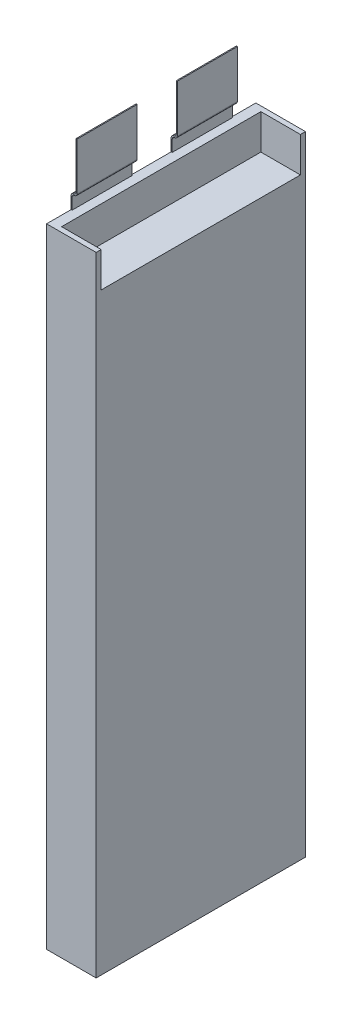
ISO-10303-21;
HEADER;
FILE_DESCRIPTION(('STEP AP214'),'2;1');
FILE_NAME('part.step','',(''),(''),'','','');
FILE_SCHEMA(('AUTOMOTIVE_DESIGN { 1 0 10303 214 1 1 1 1 }'));
ENDSEC;
DATA;
#1=APPLICATION_CONTEXT('core data for automotive mechanical design processes');
#2=APPLICATION_PROTOCOL_DEFINITION('international standard','automotive_design',2000,#1);
#3=PRODUCT_CONTEXT('',#1,'mechanical');
#4=PRODUCT('Part','Part','',(#3));
#5=PRODUCT_RELATED_PRODUCT_CATEGORY('part','',(#4));
#6=PRODUCT_DEFINITION_FORMATION('','',#4);
#7=PRODUCT_DEFINITION_CONTEXT('part definition',#1,'design');
#8=PRODUCT_DEFINITION('design','',#6,#7);
#9=PRODUCT_DEFINITION_SHAPE('','',#8);
#10=(LENGTH_UNIT() NAMED_UNIT(*) SI_UNIT(.MILLI.,.METRE.));
#11=(NAMED_UNIT(*) PLANE_ANGLE_UNIT() SI_UNIT($,.RADIAN.));
#12=(NAMED_UNIT(*) SI_UNIT($,.STERADIAN.) SOLID_ANGLE_UNIT());
#13=UNCERTAINTY_MEASURE_WITH_UNIT(LENGTH_MEASURE(1.E-05),#10,'distance_accuracy_value','');
#14=(GEOMETRIC_REPRESENTATION_CONTEXT(3) GLOBAL_UNCERTAINTY_ASSIGNED_CONTEXT((#13)) GLOBAL_UNIT_ASSIGNED_CONTEXT((#10,
#11,#12)) REPRESENTATION_CONTEXT('',''));
#15=CARTESIAN_POINT('',(0.,0.,0.));
#16=DIRECTION('',(0.,0.,1.));
#17=DIRECTION('',(1.,0.,0.));
#18=AXIS2_PLACEMENT_3D('',#15,#16,#17);
#19=CARTESIAN_POINT('',(0.,150.5,-16.9));
#20=DIRECTION('',(0.,0.,-1.));
#21=DIRECTION('',(0.,-1.,0.));
#22=AXIS2_PLACEMENT_3D('',#19,#20,#21);
#23=PLANE('',#22);
#24=DIRECTION('',(0.,-1.,0.));
#25=VECTOR('',#24,1.);
#26=CARTESIAN_POINT('',(1.,150.5,-16.9));
#27=LINE('',#26,#25);
#28=CARTESIAN_POINT('',(1.,128.,-16.9));
#29=VERTEX_POINT('',#28);
#30=CARTESIAN_POINT('',(1.,125.5,-16.9));
#31=VERTEX_POINT('',#30);
#32=EDGE_CURVE('P0_E170',#29,#31,#27,.T.);
#33=ORIENTED_EDGE('',*,*,#32,.F.);
#34=CARTESIAN_POINT('',(1.5,128.,-16.9));
#35=DIRECTION('',(0.,0.,-1.));
#36=DIRECTION('',(-1.,0.,0.));
#37=AXIS2_PLACEMENT_3D('',#34,#35,#36);
#38=CIRCLE('',#37,0.5);
#39=CARTESIAN_POINT('',(1.5,128.5,-16.9));
#40=VERTEX_POINT('',#39);
#41=EDGE_CURVE('P0_E194',#29,#40,#38,.T.);
#42=ORIENTED_EDGE('',*,*,#41,.T.);
#43=CARTESIAN_POINT('',(1.5,129.,-16.9));
#44=DIRECTION('',(0.,0.,-1.));
#45=DIRECTION('',(-1.,0.,0.));
#46=AXIS2_PLACEMENT_3D('',#43,#44,#45);
#47=CIRCLE('',#46,0.5);
#48=CARTESIAN_POINT('',(2.,129.,-16.9));
#49=VERTEX_POINT('',#48);
#50=EDGE_CURVE('P0_E204',#40,#49,#47,.F.);
#51=ORIENTED_EDGE('',*,*,#50,.T.);
#52=DIRECTION('',(0.,-1.,0.));
#53=VECTOR('',#52,1.);
#54=CARTESIAN_POINT('',(2.,128.5,-16.9));
#55=LINE('',#54,#53);
#56=CARTESIAN_POINT('',(2.,138.3,-16.9));
#57=VERTEX_POINT('',#56);
#58=EDGE_CURVE('P0_E138',#57,#49,#55,.T.);
#59=ORIENTED_EDGE('',*,*,#58,.F.);
#60=DIRECTION('',(-1.,0.,0.));
#61=VECTOR('',#60,1.);
#62=CARTESIAN_POINT('',(2.,138.3,-16.9));
#63=LINE('',#62,#61);
#64=CARTESIAN_POINT('',(2.2,138.3,-16.9));
#65=VERTEX_POINT('',#64);
#66=EDGE_CURVE('P0_E135',#65,#57,#63,.T.);
#67=ORIENTED_EDGE('',*,*,#66,.F.);
#68=DIRECTION('',(0.,1.,0.));
#69=VECTOR('',#68,1.);
#70=CARTESIAN_POINT('',(2.2,138.3,-16.9));
#71=LINE('',#70,#69);
#72=CARTESIAN_POINT('',(2.2,128.8,-16.9));
#73=VERTEX_POINT('',#72);
#74=EDGE_CURVE('P0_E147',#73,#65,#71,.T.);
#75=ORIENTED_EDGE('',*,*,#74,.F.);
#76=CARTESIAN_POINT('',(1.7,128.8,-16.9));
#77=DIRECTION('',(0.,0.,-1.));
#78=DIRECTION('',(-1.,0.,0.));
#79=AXIS2_PLACEMENT_3D('',#76,#77,#78);
#80=CIRCLE('',#79,0.5);
#81=CARTESIAN_POINT('',(1.7,128.3,-16.9));
#82=VERTEX_POINT('',#81);
#83=EDGE_CURVE('P0_E69',#73,#82,#80,.T.);
#84=ORIENTED_EDGE('',*,*,#83,.T.);
#85=CARTESIAN_POINT('',(1.7,127.8,-16.9));
#86=DIRECTION('',(0.,0.,-1.));
#87=DIRECTION('',(-1.,0.,0.));
#88=AXIS2_PLACEMENT_3D('',#85,#86,#87);
#89=CIRCLE('',#88,0.5);
#90=CARTESIAN_POINT('',(1.2,127.8,-16.9));
#91=VERTEX_POINT('',#90);
#92=EDGE_CURVE('P0_E57',#82,#91,#89,.F.);
#93=ORIENTED_EDGE('',*,*,#92,.T.);
#94=DIRECTION('',(0.,-1.,0.));
#95=VECTOR('',#94,1.);
#96=CARTESIAN_POINT('',(1.2,150.5,-16.9));
#97=LINE('',#96,#95);
#98=CARTESIAN_POINT('',(1.2,125.5,-16.9));
#99=VERTEX_POINT('',#98);
#100=EDGE_CURVE('P0_E178',#91,#99,#97,.T.);
#101=ORIENTED_EDGE('',*,*,#100,.T.);
#102=DIRECTION('',(1.,0.,0.));
#103=VECTOR('',#102,1.);
#104=CARTESIAN_POINT('',(0.,125.5,-16.9));
#105=LINE('',#104,#103);
#106=EDGE_CURVE('P0_E174',#31,#99,#105,.T.);
#107=ORIENTED_EDGE('',*,*,#106,.F.);
#108=EDGE_LOOP('',(#33,#42,#51,#59,#67,#75,#84,#93,#101,#107));
#109=FACE_BOUND('',#108,.T.);
#110=ADVANCED_FACE('P0_F48',(#109),#23,.T.);
#111=CARTESIAN_POINT('',(1.,150.5,0.));
#112=DIRECTION('',(1.,0.,0.));
#113=DIRECTION('',(0.,1.,0.));
#114=AXIS2_PLACEMENT_3D('',#111,#112,#113);
#115=PLANE('',#114);
#116=DIRECTION('',(0.,-1.,0.));
#117=VECTOR('',#116,1.);
#118=CARTESIAN_POINT('',(1.,150.5,-4.9));
#119=LINE('',#118,#117);
#120=CARTESIAN_POINT('',(1.,128.,-4.9));
#121=VERTEX_POINT('',#120);
#122=CARTESIAN_POINT('',(1.,125.5,-4.9));
#123=VERTEX_POINT('',#122);
#124=EDGE_CURVE('P0_E163',#121,#123,#119,.T.);
#125=ORIENTED_EDGE('',*,*,#124,.F.);
#126=DIRECTION('',(0.,0.,1.));
#127=VECTOR('',#126,1.);
#128=CARTESIAN_POINT('',(1.,128.,-16.9));
#129=LINE('',#128,#127);
#130=EDGE_CURVE('P0_E190',#121,#29,#129,.F.);
#131=ORIENTED_EDGE('',*,*,#130,.T.);
#132=ORIENTED_EDGE('',*,*,#32,.T.);
#133=DIRECTION('',(0.,0.,1.));
#134=VECTOR('',#133,1.);
#135=CARTESIAN_POINT('',(1.,125.5,0.));
#136=LINE('',#135,#134);
#137=EDGE_CURVE('P0_E172',#31,#123,#136,.T.);
#138=ORIENTED_EDGE('',*,*,#137,.T.);
#139=EDGE_LOOP('',(#125,#131,#132,#138));
#140=FACE_BOUND('',#139,.T.);
#141=ADVANCED_FACE('P0_F232',(#140),#115,.F.);
#142=CARTESIAN_POINT('',(0.,150.5,-4.9));
#143=DIRECTION('',(0.,0.,-1.));
#144=DIRECTION('',(0.,-1.,0.));
#145=AXIS2_PLACEMENT_3D('',#142,#143,#144);
#146=PLANE('',#145);
#147=DIRECTION('',(0.,-1.,0.));
#148=VECTOR('',#147,1.);
#149=CARTESIAN_POINT('',(2.,128.5,-4.9));
#150=LINE('',#149,#148);
#151=CARTESIAN_POINT('',(2.,138.3,-4.9));
#152=VERTEX_POINT('',#151);
#153=CARTESIAN_POINT('',(2.,129.,-4.9));
#154=VERTEX_POINT('',#153);
#155=EDGE_CURVE('P0_E141',#152,#154,#150,.T.);
#156=ORIENTED_EDGE('',*,*,#155,.T.);
#157=CARTESIAN_POINT('',(1.5,129.,-4.9));
#158=DIRECTION('',(0.,0.,-1.));
#159=DIRECTION('',(-1.,0.,0.));
#160=AXIS2_PLACEMENT_3D('',#157,#158,#159);
#161=CIRCLE('',#160,0.5);
#162=CARTESIAN_POINT('',(1.5,128.5,-4.9));
#163=VERTEX_POINT('',#162);
#164=EDGE_CURVE('P0_E202',#154,#163,#161,.T.);
#165=ORIENTED_EDGE('',*,*,#164,.T.);
#166=CARTESIAN_POINT('',(1.5,128.,-4.9));
#167=DIRECTION('',(0.,0.,-1.));
#168=DIRECTION('',(-1.,0.,0.));
#169=AXIS2_PLACEMENT_3D('',#166,#167,#168);
#170=CIRCLE('',#169,0.5);
#171=EDGE_CURVE('P0_E188',#163,#121,#170,.F.);
#172=ORIENTED_EDGE('',*,*,#171,.T.);
#173=ORIENTED_EDGE('',*,*,#124,.T.);
#174=DIRECTION('',(1.,0.,0.));
#175=VECTOR('',#174,1.);
#176=CARTESIAN_POINT('',(0.,125.5,-4.9));
#177=LINE('',#176,#175);
#178=CARTESIAN_POINT('',(1.2,125.5,-4.9));
#179=VERTEX_POINT('',#178);
#180=EDGE_CURVE('P0_E165',#123,#179,#177,.T.);
#181=ORIENTED_EDGE('',*,*,#180,.T.);
#182=DIRECTION('',(0.,-1.,0.));
#183=VECTOR('',#182,1.);
#184=CARTESIAN_POINT('',(1.2,150.5,-4.9));
#185=LINE('',#184,#183);
#186=CARTESIAN_POINT('',(1.2,127.8,-4.9));
#187=VERTEX_POINT('',#186);
#188=EDGE_CURVE('P0_E166',#187,#179,#185,.T.);
#189=ORIENTED_EDGE('',*,*,#188,.F.);
#190=CARTESIAN_POINT('',(1.7,127.8,-4.9));
#191=DIRECTION('',(0.,0.,-1.));
#192=DIRECTION('',(-1.,0.,0.));
#193=AXIS2_PLACEMENT_3D('',#190,#191,#192);
#194=CIRCLE('',#193,0.5);
#195=CARTESIAN_POINT('',(1.7,128.3,-4.9));
#196=VERTEX_POINT('',#195);
#197=EDGE_CURVE('P0_E12',#187,#196,#194,.T.);
#198=ORIENTED_EDGE('',*,*,#197,.T.);
#199=CARTESIAN_POINT('',(1.7,128.8,-4.9));
#200=DIRECTION('',(0.,0.,-1.));
#201=DIRECTION('',(-1.,0.,0.));
#202=AXIS2_PLACEMENT_3D('',#199,#200,#201);
#203=CIRCLE('',#202,0.5);
#204=CARTESIAN_POINT('',(2.2,128.8,-4.9));
#205=VERTEX_POINT('',#204);
#206=EDGE_CURVE('P0_E180',#196,#205,#203,.F.);
#207=ORIENTED_EDGE('',*,*,#206,.T.);
#208=DIRECTION('',(0.,1.,0.));
#209=VECTOR('',#208,1.);
#210=CARTESIAN_POINT('',(2.2,138.3,-4.9));
#211=LINE('',#210,#209);
#212=CARTESIAN_POINT('',(2.2,138.3,-4.9));
#213=VERTEX_POINT('',#212);
#214=EDGE_CURVE('P0_E151',#205,#213,#211,.T.);
#215=ORIENTED_EDGE('',*,*,#214,.T.);
#216=DIRECTION('',(-1.,0.,0.));
#217=VECTOR('',#216,1.);
#218=CARTESIAN_POINT('',(2.,138.3,-4.9));
#219=LINE('',#218,#217);
#220=EDGE_CURVE('P0_E133',#213,#152,#219,.T.);
#221=ORIENTED_EDGE('',*,*,#220,.T.);
#222=EDGE_LOOP('',(#156,#165,#172,#173,#181,#189,#198,#207,#215,#221));
#223=FACE_BOUND('',#222,.T.);
#224=ADVANCED_FACE('P0_F149',(#223),#146,.F.);
#225=CARTESIAN_POINT('',(1.2,150.5,0.));
#226=DIRECTION('',(1.,0.,0.));
#227=DIRECTION('',(0.,1.,0.));
#228=AXIS2_PLACEMENT_3D('',#225,#226,#227);
#229=PLANE('',#228);
#230=ORIENTED_EDGE('',*,*,#100,.F.);
#231=DIRECTION('',(0.,0.,-1.));
#232=VECTOR('',#231,1.);
#233=CARTESIAN_POINT('',(1.2,127.8,-4.9));
#234=LINE('',#233,#232);
#235=EDGE_CURVE('P0_E200',#91,#187,#234,.F.);
#236=ORIENTED_EDGE('',*,*,#235,.T.);
#237=ORIENTED_EDGE('',*,*,#188,.T.);
#238=DIRECTION('',(0.,0.,1.));
#239=VECTOR('',#238,1.);
#240=CARTESIAN_POINT('',(1.2,125.5,0.));
#241=LINE('',#240,#239);
#242=EDGE_CURVE('P0_E158',#99,#179,#241,.T.);
#243=ORIENTED_EDGE('',*,*,#242,.F.);
#244=EDGE_LOOP('',(#230,#236,#237,#243));
#245=FACE_BOUND('',#244,.T.);
#246=ADVANCED_FACE('P0_F221',(#245),#229,.T.);
#247=CARTESIAN_POINT('',(0.,125.5,0.));
#248=DIRECTION('',(0.,1.,0.));
#249=DIRECTION('',(1.,0.,0.));
#250=AXIS2_PLACEMENT_3D('',#247,#248,#249);
#251=PLANE('',#250);
#252=ORIENTED_EDGE('',*,*,#106,.T.);
#253=ORIENTED_EDGE('',*,*,#242,.T.);
#254=ORIENTED_EDGE('',*,*,#180,.F.);
#255=ORIENTED_EDGE('',*,*,#137,.F.);
#256=EDGE_LOOP('',(#252,#253,#254,#255));
#257=FACE_BOUND('',#256,.T.);
#258=ADVANCED_FACE('P0_F227',(#257),#251,.F.);
#259=CARTESIAN_POINT('',(2.2,138.3,-26.9717426496113));
#260=DIRECTION('',(1.,0.,0.));
#261=DIRECTION('',(0.,1.,0.));
#262=AXIS2_PLACEMENT_3D('',#259,#260,#261);
#263=PLANE('',#262);
#264=ORIENTED_EDGE('',*,*,#214,.F.);
#265=DIRECTION('',(0.,0.,1.));
#266=VECTOR('',#265,1.);
#267=CARTESIAN_POINT('',(2.2,128.8,-26.9717426496113));
#268=LINE('',#267,#266);
#269=EDGE_CURVE('P0_E197',#205,#73,#268,.F.);
#270=ORIENTED_EDGE('',*,*,#269,.T.);
#271=ORIENTED_EDGE('',*,*,#74,.T.);
#272=DIRECTION('',(0.,0.,1.));
#273=VECTOR('',#272,1.);
#274=CARTESIAN_POINT('',(2.2,138.3,-26.9717426496113));
#275=LINE('',#274,#273);
#276=EDGE_CURVE('P0_E160',#65,#213,#275,.T.);
#277=ORIENTED_EDGE('',*,*,#276,.T.);
#278=EDGE_LOOP('',(#264,#270,#271,#277));
#279=FACE_BOUND('',#278,.T.);
#280=ADVANCED_FACE('P0_F238',(#279),#263,.T.);
#281=CARTESIAN_POINT('',(2.,138.3,-26.9717426496113));
#282=DIRECTION('',(0.,1.,0.));
#283=DIRECTION('',(0.,0.,1.));
#284=AXIS2_PLACEMENT_3D('',#281,#282,#283);
#285=PLANE('',#284);
#286=ORIENTED_EDGE('',*,*,#276,.F.);
#287=ORIENTED_EDGE('',*,*,#66,.T.);
#288=DIRECTION('',(0.,0.,1.));
#289=VECTOR('',#288,1.);
#290=CARTESIAN_POINT('',(2.,138.3,-26.9717426496113));
#291=LINE('',#290,#289);
#292=EDGE_CURVE('P0_E128',#57,#152,#291,.T.);
#293=ORIENTED_EDGE('',*,*,#292,.T.);
#294=ORIENTED_EDGE('',*,*,#220,.F.);
#295=EDGE_LOOP('',(#286,#287,#293,#294));
#296=FACE_BOUND('',#295,.T.);
#297=ADVANCED_FACE('P0_F131',(#296),#285,.T.);
#298=CARTESIAN_POINT('',(2.,128.5,-26.9717426496113));
#299=DIRECTION('',(-1.,0.,0.));
#300=DIRECTION('',(0.,0.,1.));
#301=AXIS2_PLACEMENT_3D('',#298,#299,#300);
#302=PLANE('',#301);
#303=ORIENTED_EDGE('',*,*,#58,.T.);
#304=DIRECTION('',(0.,0.,1.));
#305=VECTOR('',#304,1.);
#306=CARTESIAN_POINT('',(2.,129.,-4.9));
#307=LINE('',#306,#305);
#308=EDGE_CURVE('P0_E144',#49,#154,#307,.T.);
#309=ORIENTED_EDGE('',*,*,#308,.T.);
#310=ORIENTED_EDGE('',*,*,#155,.F.);
#311=ORIENTED_EDGE('',*,*,#292,.F.);
#312=EDGE_LOOP('',(#303,#309,#310,#311));
#313=FACE_BOUND('',#312,.T.);
#314=ADVANCED_FACE('P0_F142',(#313),#302,.T.);
#315=CARTESIAN_POINT('',(1.5,129.,-26.9717426496113));
#316=DIRECTION('',(0.,0.,-1.));
#317=DIRECTION('',(-1.,0.,0.));
#318=AXIS2_PLACEMENT_3D('',#315,#316,#317);
#319=CYLINDRICAL_SURFACE('',#318,0.5);
#320=ORIENTED_EDGE('',*,*,#308,.F.);
#321=ORIENTED_EDGE('',*,*,#50,.F.);
#322=DIRECTION('',(0.,0.,1.));
#323=VECTOR('',#322,1.);
#324=CARTESIAN_POINT('',(1.5,128.5,-16.9));
#325=LINE('',#324,#323);
#326=EDGE_CURVE('P0_E154',#163,#40,#325,.F.);
#327=ORIENTED_EDGE('',*,*,#326,.F.);
#328=ORIENTED_EDGE('',*,*,#164,.F.);
#329=EDGE_LOOP('',(#320,#321,#327,#328));
#330=FACE_BOUND('',#329,.T.);
#331=ADVANCED_FACE('P0_F236',(#330),#319,.F.);
#332=CARTESIAN_POINT('',(1.5,128.,-49.1969532372423));
#333=DIRECTION('',(0.,0.,-1.));
#334=DIRECTION('',(-1.,0.,0.));
#335=AXIS2_PLACEMENT_3D('',#332,#333,#334);
#336=CYLINDRICAL_SURFACE('',#335,0.5);
#337=ORIENTED_EDGE('',*,*,#41,.F.);
#338=ORIENTED_EDGE('',*,*,#130,.F.);
#339=ORIENTED_EDGE('',*,*,#171,.F.);
#340=ORIENTED_EDGE('',*,*,#326,.T.);
#341=EDGE_LOOP('',(#337,#338,#339,#340));
#342=FACE_BOUND('',#341,.T.);
#343=ADVANCED_FACE('P0_F234',(#342),#336,.T.);
#344=CARTESIAN_POINT('',(1.69999999999999,127.8,-26.9717426496113));
#345=DIRECTION('',(0.,0.,1.));
#346=DIRECTION('',(1.,0.,0.));
#347=AXIS2_PLACEMENT_3D('',#344,#345,#346);
#348=CYLINDRICAL_SURFACE('',#347,0.5);
#349=ORIENTED_EDGE('',*,*,#235,.F.);
#350=ORIENTED_EDGE('',*,*,#92,.F.);
#351=DIRECTION('',(0.,0.,-1.));
#352=VECTOR('',#351,1.);
#353=CARTESIAN_POINT('',(1.7,128.3,-16.9));
#354=LINE('',#353,#352);
#355=EDGE_CURVE('P0_E52',#196,#82,#354,.T.);
#356=ORIENTED_EDGE('',*,*,#355,.F.);
#357=ORIENTED_EDGE('',*,*,#197,.F.);
#358=EDGE_LOOP('',(#349,#350,#356,#357));
#359=FACE_BOUND('',#358,.T.);
#360=ADVANCED_FACE('P0_F50',(#359),#348,.F.);
#361=CARTESIAN_POINT('',(1.7,128.8,-26.9717426496113));
#362=DIRECTION('',(0.,0.,1.));
#363=DIRECTION('',(1.,0.,0.));
#364=AXIS2_PLACEMENT_3D('',#361,#362,#363);
#365=CYLINDRICAL_SURFACE('',#364,0.5);
#366=ORIENTED_EDGE('',*,*,#83,.F.);
#367=ORIENTED_EDGE('',*,*,#269,.F.);
#368=ORIENTED_EDGE('',*,*,#206,.F.);
#369=ORIENTED_EDGE('',*,*,#355,.T.);
#370=EDGE_LOOP('',(#366,#367,#368,#369));
#371=FACE_BOUND('',#370,.T.);
#372=ADVANCED_FACE('P0_F214',(#371),#365,.T.);
#373=CLOSED_SHELL('',(#110,#141,#224,#246,#258,#280,#297,#314,#331,#343,#360,#372));
#374=MANIFOLD_SOLID_BREP('P0_B2',#373);
#375=CARTESIAN_POINT('',(0.,150.5,-24.9));
#376=DIRECTION('',(0.,0.,-1.));
#377=DIRECTION('',(0.,-1.,0.));
#378=AXIS2_PLACEMENT_3D('',#375,#376,#377);
#379=PLANE('',#378);
#380=DIRECTION('',(0.,-1.,0.));
#381=VECTOR('',#380,1.);
#382=CARTESIAN_POINT('',(1.2,150.5,-24.9));
#383=LINE('',#382,#381);
#384=CARTESIAN_POINT('',(1.2,127.8,-24.9));
#385=VERTEX_POINT('',#384);
#386=CARTESIAN_POINT('',(1.2,125.5,-24.9));
#387=VERTEX_POINT('',#386);
#388=EDGE_CURVE('P0_E480',#385,#387,#383,.T.);
#389=ORIENTED_EDGE('',*,*,#388,.F.);
#390=CARTESIAN_POINT('',(1.7,127.8,-24.9));
#391=DIRECTION('',(0.,0.,-1.));
#392=DIRECTION('',(-1.,0.,0.));
#393=AXIS2_PLACEMENT_3D('',#390,#391,#392);
#394=CIRCLE('',#393,0.5);
#395=CARTESIAN_POINT('',(1.7,128.3,-24.9));
#396=VERTEX_POINT('',#395);
#397=EDGE_CURVE('P0_E503',#385,#396,#394,.T.);
#398=ORIENTED_EDGE('',*,*,#397,.T.);
#399=CARTESIAN_POINT('',(1.7,128.8,-24.9));
#400=DIRECTION('',(0.,0.,-1.));
#401=DIRECTION('',(-1.,0.,0.));
#402=AXIS2_PLACEMENT_3D('',#399,#400,#401);
#403=CIRCLE('',#402,0.5);
#404=CARTESIAN_POINT('',(2.2,128.8,-24.9));
#405=VERTEX_POINT('',#404);
#406=EDGE_CURVE('P0_E494',#396,#405,#403,.F.);
#407=ORIENTED_EDGE('',*,*,#406,.T.);
#408=DIRECTION('',(0.,1.,0.));
#409=VECTOR('',#408,1.);
#410=CARTESIAN_POINT('',(2.2,138.3,-24.9));
#411=LINE('',#410,#409);
#412=CARTESIAN_POINT('',(2.2,138.3,-24.9));
#413=VERTEX_POINT('',#412);
#414=EDGE_CURVE('P0_E466',#405,#413,#411,.T.);
#415=ORIENTED_EDGE('',*,*,#414,.T.);
#416=DIRECTION('',(-1.,0.,0.));
#417=VECTOR('',#416,1.);
#418=CARTESIAN_POINT('',(2.,138.3,-24.9));
#419=LINE('',#418,#417);
#420=CARTESIAN_POINT('',(2.,138.3,-24.9));
#421=VERTEX_POINT('',#420);
#422=EDGE_CURVE('P0_E517',#413,#421,#419,.T.);
#423=ORIENTED_EDGE('',*,*,#422,.T.);
#424=DIRECTION('',(0.,-1.,0.));
#425=VECTOR('',#424,1.);
#426=CARTESIAN_POINT('',(2.,128.5,-24.9));
#427=LINE('',#426,#425);
#428=CARTESIAN_POINT('',(2.,129.,-24.9));
#429=VERTEX_POINT('',#428);
#430=EDGE_CURVE('P0_E447',#421,#429,#427,.T.);
#431=ORIENTED_EDGE('',*,*,#430,.T.);
#432=CARTESIAN_POINT('',(1.5,129.,-24.9));
#433=DIRECTION('',(0.,0.,-1.));
#434=DIRECTION('',(-1.,0.,0.));
#435=AXIS2_PLACEMENT_3D('',#432,#433,#434);
#436=CIRCLE('',#435,0.5);
#437=CARTESIAN_POINT('',(1.5,128.5,-24.9));
#438=VERTEX_POINT('',#437);
#439=EDGE_CURVE('P0_E46',#429,#438,#436,.T.);
#440=ORIENTED_EDGE('',*,*,#439,.T.);
#441=CARTESIAN_POINT('',(1.5,128.,-24.9));
#442=DIRECTION('',(0.,0.,-1.));
#443=DIRECTION('',(-1.,0.,0.));
#444=AXIS2_PLACEMENT_3D('',#441,#442,#443);
#445=CIRCLE('',#444,0.5);
#446=CARTESIAN_POINT('',(1.,128.,-24.9));
#447=VERTEX_POINT('',#446);
#448=EDGE_CURVE('P0_E367',#438,#447,#445,.F.);
#449=ORIENTED_EDGE('',*,*,#448,.T.);
#450=DIRECTION('',(0.,-1.,0.));
#451=VECTOR('',#450,1.);
#452=CARTESIAN_POINT('',(1.,150.5,-24.9));
#453=LINE('',#452,#451);
#454=CARTESIAN_POINT('',(1.,125.5,-24.9));
#455=VERTEX_POINT('',#454);
#456=EDGE_CURVE('P0_E473',#447,#455,#453,.T.);
#457=ORIENTED_EDGE('',*,*,#456,.T.);
#458=DIRECTION('',(1.,0.,0.));
#459=VECTOR('',#458,1.);
#460=CARTESIAN_POINT('',(0.,125.5,-24.9));
#461=LINE('',#460,#459);
#462=EDGE_CURVE('P0_E475',#455,#387,#461,.T.);
#463=ORIENTED_EDGE('',*,*,#462,.T.);
#464=EDGE_LOOP('',(#389,#398,#407,#415,#423,#431,#440,#449,#457,#463));
#465=FACE_BOUND('',#464,.T.);
#466=ADVANCED_FACE('P0_F351',(#465),#379,.F.);
#467=CARTESIAN_POINT('',(1.2,150.5,0.));
#468=DIRECTION('',(-1.,0.,0.));
#469=DIRECTION('',(0.,0.,1.));
#470=AXIS2_PLACEMENT_3D('',#467,#468,#469);
#471=PLANE('',#470);
#472=DIRECTION('',(0.,-1.,0.));
#473=VECTOR('',#472,1.);
#474=CARTESIAN_POINT('',(1.2,150.5,-36.9));
#475=LINE('',#474,#473);
#476=CARTESIAN_POINT('',(1.2,127.8,-36.9));
#477=VERTEX_POINT('',#476);
#478=CARTESIAN_POINT('',(1.2,125.5,-36.9));
#479=VERTEX_POINT('',#478);
#480=EDGE_CURVE('P0_E471',#477,#479,#475,.T.);
#481=ORIENTED_EDGE('',*,*,#480,.F.);
#482=DIRECTION('',(0.,0.,1.));
#483=VECTOR('',#482,1.);
#484=CARTESIAN_POINT('',(1.2,127.8,0.));
#485=LINE('',#484,#483);
#486=EDGE_CURVE('P0_E496',#477,#385,#485,.T.);
#487=ORIENTED_EDGE('',*,*,#486,.T.);
#488=ORIENTED_EDGE('',*,*,#388,.T.);
#489=DIRECTION('',(0.,0.,-1.));
#490=VECTOR('',#489,1.);
#491=CARTESIAN_POINT('',(1.2,125.5,0.));
#492=LINE('',#491,#490);
#493=EDGE_CURVE('P0_E476',#387,#479,#492,.T.);
#494=ORIENTED_EDGE('',*,*,#493,.T.);
#495=EDGE_LOOP('',(#481,#487,#488,#494));
#496=FACE_BOUND('',#495,.T.);
#497=ADVANCED_FACE('P0_F531',(#496),#471,.F.);
#498=CARTESIAN_POINT('',(0.,150.5,-36.9));
#499=DIRECTION('',(0.,0.,-1.));
#500=DIRECTION('',(0.,-1.,0.));
#501=AXIS2_PLACEMENT_3D('',#498,#499,#500);
#502=PLANE('',#501);
#503=DIRECTION('',(0.,-1.,0.));
#504=VECTOR('',#503,1.);
#505=CARTESIAN_POINT('',(2.2,138.3,-36.9));
#506=LINE('',#505,#504);
#507=CARTESIAN_POINT('',(2.2,138.3,-36.9));
#508=VERTEX_POINT('',#507);
#509=CARTESIAN_POINT('',(2.2,128.8,-36.9));
#510=VERTEX_POINT('',#509);
#511=EDGE_CURVE('P0_E451',#508,#510,#506,.T.);
#512=ORIENTED_EDGE('',*,*,#511,.T.);
#513=CARTESIAN_POINT('',(1.7,128.8,-36.9));
#514=DIRECTION('',(0.,0.,-1.));
#515=DIRECTION('',(-1.,0.,0.));
#516=AXIS2_PLACEMENT_3D('',#513,#514,#515);
#517=CIRCLE('',#516,0.5);
#518=CARTESIAN_POINT('',(1.7,128.3,-36.9));
#519=VERTEX_POINT('',#518);
#520=EDGE_CURVE('P0_E491',#510,#519,#517,.T.);
#521=ORIENTED_EDGE('',*,*,#520,.T.);
#522=CARTESIAN_POINT('',(1.7,127.8,-36.9));
#523=DIRECTION('',(0.,0.,-1.));
#524=DIRECTION('',(-1.,0.,0.));
#525=AXIS2_PLACEMENT_3D('',#522,#523,#524);
#526=CIRCLE('',#525,0.5);
#527=EDGE_CURVE('P0_E505',#519,#477,#526,.F.);
#528=ORIENTED_EDGE('',*,*,#527,.T.);
#529=ORIENTED_EDGE('',*,*,#480,.T.);
#530=DIRECTION('',(1.,0.,0.));
#531=VECTOR('',#530,1.);
#532=CARTESIAN_POINT('',(0.,125.5,-36.9));
#533=LINE('',#532,#531);
#534=CARTESIAN_POINT('',(1.,125.5,-36.9));
#535=VERTEX_POINT('',#534);
#536=EDGE_CURVE('P0_E461',#535,#479,#533,.T.);
#537=ORIENTED_EDGE('',*,*,#536,.F.);
#538=DIRECTION('',(0.,-1.,0.));
#539=VECTOR('',#538,1.);
#540=CARTESIAN_POINT('',(1.,150.5,-36.9));
#541=LINE('',#540,#539);
#542=CARTESIAN_POINT('',(1.,128.,-36.9));
#543=VERTEX_POINT('',#542);
#544=EDGE_CURVE('P0_E465',#543,#535,#541,.T.);
#545=ORIENTED_EDGE('',*,*,#544,.F.);
#546=CARTESIAN_POINT('',(1.5,128.,-36.9));
#547=DIRECTION('',(0.,0.,-1.));
#548=DIRECTION('',(-1.,0.,0.));
#549=AXIS2_PLACEMENT_3D('',#546,#547,#548);
#550=CIRCLE('',#549,0.5);
#551=CARTESIAN_POINT('',(1.5,128.5,-36.9));
#552=VERTEX_POINT('',#551);
#553=EDGE_CURVE('P0_E489',#543,#552,#550,.T.);
#554=ORIENTED_EDGE('',*,*,#553,.T.);
#555=CARTESIAN_POINT('',(1.5,129.,-36.9));
#556=DIRECTION('',(0.,0.,-1.));
#557=DIRECTION('',(-1.,0.,0.));
#558=AXIS2_PLACEMENT_3D('',#555,#556,#557);
#559=CIRCLE('',#558,0.5);
#560=CARTESIAN_POINT('',(2.,129.,-36.9));
#561=VERTEX_POINT('',#560);
#562=EDGE_CURVE('P0_E360',#552,#561,#559,.F.);
#563=ORIENTED_EDGE('',*,*,#562,.T.);
#564=DIRECTION('',(0.,1.,0.));
#565=VECTOR('',#564,1.);
#566=CARTESIAN_POINT('',(2.,128.5,-36.9));
#567=LINE('',#566,#565);
#568=CARTESIAN_POINT('',(2.,138.3,-36.9));
#569=VERTEX_POINT('',#568);
#570=EDGE_CURVE('P0_E432',#561,#569,#567,.T.);
#571=ORIENTED_EDGE('',*,*,#570,.T.);
#572=DIRECTION('',(1.,0.,0.));
#573=VECTOR('',#572,1.);
#574=CARTESIAN_POINT('',(2.,138.3,-36.9));
#575=LINE('',#574,#573);
#576=EDGE_CURVE('P0_E437',#569,#508,#575,.T.);
#577=ORIENTED_EDGE('',*,*,#576,.T.);
#578=EDGE_LOOP('',(#512,#521,#528,#529,#537,#545,#554,#563,#571,#577));
#579=FACE_BOUND('',#578,.T.);
#580=ADVANCED_FACE('P0_F435',(#579),#502,.T.);
#581=CARTESIAN_POINT('',(1.,150.5,0.));
#582=DIRECTION('',(1.,0.,0.));
#583=DIRECTION('',(0.,1.,0.));
#584=AXIS2_PLACEMENT_3D('',#581,#582,#583);
#585=PLANE('',#584);
#586=ORIENTED_EDGE('',*,*,#456,.F.);
#587=DIRECTION('',(0.,0.,1.));
#588=VECTOR('',#587,1.);
#589=CARTESIAN_POINT('',(1.,128.,-36.9));
#590=LINE('',#589,#588);
#591=EDGE_CURVE('P0_E498',#447,#543,#590,.F.);
#592=ORIENTED_EDGE('',*,*,#591,.T.);
#593=ORIENTED_EDGE('',*,*,#544,.T.);
#594=DIRECTION('',(0.,0.,1.));
#595=VECTOR('',#594,1.);
#596=CARTESIAN_POINT('',(1.,125.5,0.));
#597=LINE('',#596,#595);
#598=EDGE_CURVE('P0_E467',#535,#455,#597,.T.);
#599=ORIENTED_EDGE('',*,*,#598,.T.);
#600=EDGE_LOOP('',(#586,#592,#593,#599));
#601=FACE_BOUND('',#600,.T.);
#602=ADVANCED_FACE('P0_F540',(#601),#585,.F.);
#603=CARTESIAN_POINT('',(0.,125.5,0.));
#604=DIRECTION('',(0.,1.,0.));
#605=DIRECTION('',(1.,0.,0.));
#606=AXIS2_PLACEMENT_3D('',#603,#604,#605);
#607=PLANE('',#606);
#608=ORIENTED_EDGE('',*,*,#462,.F.);
#609=ORIENTED_EDGE('',*,*,#598,.F.);
#610=ORIENTED_EDGE('',*,*,#536,.T.);
#611=ORIENTED_EDGE('',*,*,#493,.F.);
#612=EDGE_LOOP('',(#608,#609,#610,#611));
#613=FACE_BOUND('',#612,.T.);
#614=ADVANCED_FACE('P0_F536',(#613),#607,.F.);
#615=CARTESIAN_POINT('',(2.2,138.3,-14.8282573503887));
#616=DIRECTION('',(1.,0.,0.));
#617=DIRECTION('',(0.,1.,0.));
#618=AXIS2_PLACEMENT_3D('',#615,#616,#617);
#619=PLANE('',#618);
#620=ORIENTED_EDGE('',*,*,#414,.F.);
#621=DIRECTION('',(0.,0.,-1.));
#622=VECTOR('',#621,1.);
#623=CARTESIAN_POINT('',(2.2,128.8,-14.8282573503887));
#624=LINE('',#623,#622);
#625=EDGE_CURVE('P0_E486',#405,#510,#624,.T.);
#626=ORIENTED_EDGE('',*,*,#625,.T.);
#627=ORIENTED_EDGE('',*,*,#511,.F.);
#628=DIRECTION('',(0.,0.,-1.));
#629=VECTOR('',#628,1.);
#630=CARTESIAN_POINT('',(2.2,138.3,-14.8282573503887));
#631=LINE('',#630,#629);
#632=EDGE_CURVE('P0_E450',#413,#508,#631,.T.);
#633=ORIENTED_EDGE('',*,*,#632,.F.);
#634=EDGE_LOOP('',(#620,#626,#627,#633));
#635=FACE_BOUND('',#634,.T.);
#636=ADVANCED_FACE('P0_F523',(#635),#619,.T.);
#637=CARTESIAN_POINT('',(2.,138.3,-14.8282573503887));
#638=DIRECTION('',(0.,1.,0.));
#639=DIRECTION('',(0.,0.,1.));
#640=AXIS2_PLACEMENT_3D('',#637,#638,#639);
#641=PLANE('',#640);
#642=ORIENTED_EDGE('',*,*,#422,.F.);
#643=ORIENTED_EDGE('',*,*,#632,.T.);
#644=ORIENTED_EDGE('',*,*,#576,.F.);
#645=DIRECTION('',(0.,0.,-1.));
#646=VECTOR('',#645,1.);
#647=CARTESIAN_POINT('',(2.,138.3,-14.8282573503887));
#648=LINE('',#647,#646);
#649=EDGE_CURVE('P0_E445',#421,#569,#648,.T.);
#650=ORIENTED_EDGE('',*,*,#649,.F.);
#651=EDGE_LOOP('',(#642,#643,#644,#650));
#652=FACE_BOUND('',#651,.T.);
#653=ADVANCED_FACE('P0_F453',(#652),#641,.T.);
#654=CARTESIAN_POINT('',(2.,128.5,-14.8282573503887));
#655=DIRECTION('',(-1.,0.,0.));
#656=DIRECTION('',(0.,0.,1.));
#657=AXIS2_PLACEMENT_3D('',#654,#655,#656);
#658=PLANE('',#657);
#659=ORIENTED_EDGE('',*,*,#570,.F.);
#660=DIRECTION('',(0.,0.,-1.));
#661=VECTOR('',#660,1.);
#662=CARTESIAN_POINT('',(2.,129.,-24.9));
#663=LINE('',#662,#661);
#664=EDGE_CURVE('P0_E501',#561,#429,#663,.F.);
#665=ORIENTED_EDGE('',*,*,#664,.T.);
#666=ORIENTED_EDGE('',*,*,#430,.F.);
#667=ORIENTED_EDGE('',*,*,#649,.T.);
#668=EDGE_LOOP('',(#659,#665,#666,#667));
#669=FACE_BOUND('',#668,.T.);
#670=ADVANCED_FACE('P0_F446',(#669),#658,.T.);
#671=CARTESIAN_POINT('',(1.7,127.8,0.));
#672=DIRECTION('',(0.,0.,1.));
#673=DIRECTION('',(1.,0.,0.));
#674=AXIS2_PLACEMENT_3D('',#671,#672,#673);
#675=CYLINDRICAL_SURFACE('',#674,0.5);
#676=DIRECTION('',(0.,0.,1.));
#677=VECTOR('',#676,1.);
#678=CARTESIAN_POINT('',(1.7,128.3,-14.8282573503887));
#679=LINE('',#678,#677);
#680=EDGE_CURVE('P0_E441',#396,#519,#679,.F.);
#681=ORIENTED_EDGE('',*,*,#680,.F.);
#682=ORIENTED_EDGE('',*,*,#397,.F.);
#683=ORIENTED_EDGE('',*,*,#486,.F.);
#684=ORIENTED_EDGE('',*,*,#527,.F.);
#685=EDGE_LOOP('',(#681,#682,#683,#684));
#686=FACE_BOUND('',#685,.T.);
#687=ADVANCED_FACE('P0_F528',(#686),#675,.F.);
#688=CARTESIAN_POINT('',(1.7,128.8,-14.8282573503887));
#689=DIRECTION('',(0.,0.,-1.));
#690=DIRECTION('',(-1.,0.,0.));
#691=AXIS2_PLACEMENT_3D('',#688,#689,#690);
#692=CYLINDRICAL_SURFACE('',#691,0.5);
#693=ORIENTED_EDGE('',*,*,#406,.F.);
#694=ORIENTED_EDGE('',*,*,#680,.T.);
#695=ORIENTED_EDGE('',*,*,#520,.F.);
#696=ORIENTED_EDGE('',*,*,#625,.F.);
#697=EDGE_LOOP('',(#693,#694,#695,#696));
#698=FACE_BOUND('',#697,.T.);
#699=ADVANCED_FACE('P0_F580',(#698),#692,.T.);
#700=CARTESIAN_POINT('',(1.5,129.,-49.1969532372423));
#701=DIRECTION('',(0.,0.,1.));
#702=DIRECTION('',(1.,0.,0.));
#703=AXIS2_PLACEMENT_3D('',#700,#701,#702);
#704=CYLINDRICAL_SURFACE('',#703,0.5);
#705=ORIENTED_EDGE('',*,*,#664,.F.);
#706=ORIENTED_EDGE('',*,*,#562,.F.);
#707=DIRECTION('',(0.,0.,-1.));
#708=VECTOR('',#707,1.);
#709=CARTESIAN_POINT('',(1.5,128.5,-36.9));
#710=LINE('',#709,#708);
#711=EDGE_CURVE('P0_E355',#438,#552,#710,.T.);
#712=ORIENTED_EDGE('',*,*,#711,.F.);
#713=ORIENTED_EDGE('',*,*,#439,.F.);
#714=EDGE_LOOP('',(#705,#706,#712,#713));
#715=FACE_BOUND('',#714,.T.);
#716=ADVANCED_FACE('P0_F353',(#715),#704,.F.);
#717=CARTESIAN_POINT('',(1.5,128.,-49.1969532372423));
#718=DIRECTION('',(0.,0.,-1.));
#719=DIRECTION('',(-1.,0.,0.));
#720=AXIS2_PLACEMENT_3D('',#717,#718,#719);
#721=CYLINDRICAL_SURFACE('',#720,0.5);
#722=ORIENTED_EDGE('',*,*,#553,.F.);
#723=ORIENTED_EDGE('',*,*,#591,.F.);
#724=ORIENTED_EDGE('',*,*,#448,.F.);
#725=ORIENTED_EDGE('',*,*,#711,.T.);
#726=EDGE_LOOP('',(#722,#723,#724,#725));
#727=FACE_BOUND('',#726,.T.);
#728=ADVANCED_FACE('P0_F513',(#727),#721,.T.);
#729=CLOSED_SHELL('',(#466,#497,#580,#602,#614,#636,#653,#670,#687,#699,#716,#728));
#730=MANIFOLD_SOLID_BREP('P0_B6',#729);
#731=CARTESIAN_POINT('',(10.9,0.,-41.8));
#732=DIRECTION('',(0.,0.,1.));
#733=DIRECTION('',(1.,0.,0.));
#734=AXIS2_PLACEMENT_3D('',#731,#732,#733);
#735=PLANE('',#734);
#736=DIRECTION('',(0.,1.,0.));
#737=VECTOR('',#736,1.);
#738=CARTESIAN_POINT('',(1.,0.,-41.8));
#739=LINE('',#738,#737);
#740=CARTESIAN_POINT('',(1.,0.,-41.8));
#741=VERTEX_POINT('',#740);
#742=CARTESIAN_POINT('',(1.,125.5,-41.8));
#743=VERTEX_POINT('',#742);
#744=EDGE_CURVE('P1_E11',#741,#743,#739,.T.);
#745=ORIENTED_EDGE('',*,*,#744,.T.);
#746=DIRECTION('',(-1.,0.,0.));
#747=VECTOR('',#746,1.);
#748=CARTESIAN_POINT('',(10.9,125.5,-41.8));
#749=LINE('',#748,#747);
#750=CARTESIAN_POINT('',(10.9,125.5,-41.8));
#751=VERTEX_POINT('',#750);
#752=EDGE_CURVE('P1_E42',#751,#743,#749,.T.);
#753=ORIENTED_EDGE('',*,*,#752,.F.);
#754=DIRECTION('',(0.,1.,0.));
#755=VECTOR('',#754,1.);
#756=CARTESIAN_POINT('',(10.9,0.,-41.8));
#757=LINE('',#756,#755);
#758=CARTESIAN_POINT('',(10.9,0.,-41.8));
#759=VERTEX_POINT('',#758);
#760=EDGE_CURVE('P1_E140',#759,#751,#757,.T.);
#761=ORIENTED_EDGE('',*,*,#760,.F.);
#762=DIRECTION('',(-1.,0.,0.));
#763=VECTOR('',#762,1.);
#764=CARTESIAN_POINT('',(10.9,0.,-41.8));
#765=LINE('',#764,#763);
#766=EDGE_CURVE('P1_E27',#759,#741,#765,.T.);
#767=ORIENTED_EDGE('',*,*,#766,.T.);
#768=EDGE_LOOP('',(#745,#753,#761,#767));
#769=FACE_BOUND('',#768,.T.);
#770=ADVANCED_FACE('P1_F16',(#769),#735,.F.);
#771=CARTESIAN_POINT('',(10.9,125.5,0.));
#772=DIRECTION('',(0.,-1.,0.));
#773=DIRECTION('',(0.,0.,-1.));
#774=AXIS2_PLACEMENT_3D('',#771,#772,#773);
#775=PLANE('',#774);
#776=DIRECTION('',(0.,0.,1.));
#777=VECTOR('',#776,1.);
#778=CARTESIAN_POINT('',(10.9,125.5,0.));
#779=LINE('',#778,#777);
#780=CARTESIAN_POINT('',(10.9,125.5,-1.));
#781=VERTEX_POINT('',#780);
#782=CARTESIAN_POINT('',(10.9,125.5,0.));
#783=VERTEX_POINT('',#782);
#784=EDGE_CURVE('P1_E113',#781,#783,#779,.T.);
#785=ORIENTED_EDGE('',*,*,#784,.F.);
#786=DIRECTION('',(1.,0.,0.));
#787=VECTOR('',#786,1.);
#788=CARTESIAN_POINT('',(10.9,125.5,-1.));
#789=LINE('',#788,#787);
#790=CARTESIAN_POINT('',(3.,125.5,-1.));
#791=VERTEX_POINT('',#790);
#792=EDGE_CURVE('P1_E101',#791,#781,#789,.T.);
#793=ORIENTED_EDGE('',*,*,#792,.F.);
#794=DIRECTION('',(0.,0.,1.));
#795=VECTOR('',#794,1.);
#796=CARTESIAN_POINT('',(3.,125.5,-40.8));
#797=LINE('',#796,#795);
#798=CARTESIAN_POINT('',(3.,125.5,-40.8));
#799=VERTEX_POINT('',#798);
#800=EDGE_CURVE('P1_E164',#799,#791,#797,.T.);
#801=ORIENTED_EDGE('',*,*,#800,.F.);
#802=DIRECTION('',(-1.,0.,0.));
#803=VECTOR('',#802,1.);
#804=CARTESIAN_POINT('',(10.9,125.5,-40.8));
#805=LINE('',#804,#803);
#806=CARTESIAN_POINT('',(10.9,125.5,-40.8));
#807=VERTEX_POINT('',#806);
#808=EDGE_CURVE('P1_E152',#807,#799,#805,.T.);
#809=ORIENTED_EDGE('',*,*,#808,.F.);
#810=DIRECTION('',(0.,0.,1.));
#811=VECTOR('',#810,1.);
#812=CARTESIAN_POINT('',(10.9,125.5,0.));
#813=LINE('',#812,#811);
#814=EDGE_CURVE('P1_E110',#751,#807,#813,.T.);
#815=ORIENTED_EDGE('',*,*,#814,.F.);
#816=ORIENTED_EDGE('',*,*,#752,.T.);
#817=DIRECTION('',(0.,0.,1.));
#818=VECTOR('',#817,1.);
#819=CARTESIAN_POINT('',(1.,125.5,0.));
#820=LINE('',#819,#818);
#821=CARTESIAN_POINT('',(1.,125.5,0.));
#822=VERTEX_POINT('',#821);
#823=EDGE_CURVE('P1_E141',#743,#822,#820,.T.);
#824=ORIENTED_EDGE('',*,*,#823,.T.);
#825=DIRECTION('',(-1.,0.,0.));
#826=VECTOR('',#825,1.);
#827=CARTESIAN_POINT('',(10.9,125.5,0.));
#828=LINE('',#827,#826);
#829=EDGE_CURVE('P1_E116',#783,#822,#828,.T.);
#830=ORIENTED_EDGE('',*,*,#829,.F.);
#831=EDGE_LOOP('',(#785,#793,#801,#809,#815,#816,#824,#830));
#832=FACE_BOUND('',#831,.T.);
#833=ADVANCED_FACE('P1_F114',(#832),#775,.F.);
#834=CARTESIAN_POINT('',(10.9,0.,0.));
#835=DIRECTION('',(0.,0.,-1.));
#836=DIRECTION('',(0.,-1.,0.));
#837=AXIS2_PLACEMENT_3D('',#834,#835,#836);
#838=PLANE('',#837);
#839=DIRECTION('',(0.,-1.,0.));
#840=VECTOR('',#839,1.);
#841=CARTESIAN_POINT('',(1.,0.,0.));
#842=LINE('',#841,#840);
#843=CARTESIAN_POINT('',(1.,0.,0.));
#844=VERTEX_POINT('',#843);
#845=EDGE_CURVE('P1_E143',#822,#844,#842,.T.);
#846=ORIENTED_EDGE('',*,*,#845,.T.);
#847=DIRECTION('',(-1.,0.,0.));
#848=VECTOR('',#847,1.);
#849=CARTESIAN_POINT('',(10.9,0.,0.));
#850=LINE('',#849,#848);
#851=CARTESIAN_POINT('',(10.9,0.,0.));
#852=VERTEX_POINT('',#851);
#853=EDGE_CURVE('P1_E127',#852,#844,#850,.T.);
#854=ORIENTED_EDGE('',*,*,#853,.F.);
#855=DIRECTION('',(0.,-1.,0.));
#856=VECTOR('',#855,1.);
#857=CARTESIAN_POINT('',(10.9,0.,0.));
#858=LINE('',#857,#856);
#859=EDGE_CURVE('P1_E120',#783,#852,#858,.T.);
#860=ORIENTED_EDGE('',*,*,#859,.F.);
#861=ORIENTED_EDGE('',*,*,#829,.T.);
#862=EDGE_LOOP('',(#846,#854,#860,#861));
#863=FACE_BOUND('',#862,.T.);
#864=ADVANCED_FACE('P1_F18',(#863),#838,.F.);
#865=CARTESIAN_POINT('',(10.9,0.,0.));
#866=DIRECTION('',(0.,1.,0.));
#867=DIRECTION('',(1.,0.,0.));
#868=AXIS2_PLACEMENT_3D('',#865,#866,#867);
#869=PLANE('',#868);
#870=DIRECTION('',(0.,0.,-1.));
#871=VECTOR('',#870,1.);
#872=CARTESIAN_POINT('',(1.,0.,0.));
#873=LINE('',#872,#871);
#874=EDGE_CURVE('P1_E133',#844,#741,#873,.T.);
#875=ORIENTED_EDGE('',*,*,#874,.T.);
#876=ORIENTED_EDGE('',*,*,#766,.F.);
#877=DIRECTION('',(0.,0.,-1.));
#878=VECTOR('',#877,1.);
#879=CARTESIAN_POINT('',(10.9,0.,0.));
#880=LINE('',#879,#878);
#881=EDGE_CURVE('P1_E137',#852,#759,#880,.T.);
#882=ORIENTED_EDGE('',*,*,#881,.F.);
#883=ORIENTED_EDGE('',*,*,#853,.T.);
#884=EDGE_LOOP('',(#875,#876,#882,#883));
#885=FACE_BOUND('',#884,.T.);
#886=ADVANCED_FACE('P1_F202',(#885),#869,.F.);
#887=CARTESIAN_POINT('',(10.9,0.,0.));
#888=DIRECTION('',(-1.,0.,0.));
#889=DIRECTION('',(0.,0.,1.));
#890=AXIS2_PLACEMENT_3D('',#887,#888,#889);
#891=PLANE('',#890);
#892=DIRECTION('',(0.,0.,-1.));
#893=VECTOR('',#892,1.);
#894=CARTESIAN_POINT('',(10.9,118.5,-40.8));
#895=LINE('',#894,#893);
#896=CARTESIAN_POINT('',(10.9,118.5,-1.));
#897=VERTEX_POINT('',#896);
#898=CARTESIAN_POINT('',(10.9,118.5,-40.8));
#899=VERTEX_POINT('',#898);
#900=EDGE_CURVE('P1_E125',#897,#899,#895,.T.);
#901=ORIENTED_EDGE('',*,*,#900,.F.);
#902=DIRECTION('',(0.,1.,0.));
#903=VECTOR('',#902,1.);
#904=CARTESIAN_POINT('',(10.9,118.5,-1.));
#905=LINE('',#904,#903);
#906=EDGE_CURVE('P1_E105',#897,#781,#905,.T.);
#907=ORIENTED_EDGE('',*,*,#906,.T.);
#908=ORIENTED_EDGE('',*,*,#784,.T.);
#909=ORIENTED_EDGE('',*,*,#859,.T.);
#910=ORIENTED_EDGE('',*,*,#881,.T.);
#911=ORIENTED_EDGE('',*,*,#760,.T.);
#912=ORIENTED_EDGE('',*,*,#814,.T.);
#913=DIRECTION('',(0.,1.,0.));
#914=VECTOR('',#913,1.);
#915=CARTESIAN_POINT('',(10.9,118.5,-40.8));
#916=LINE('',#915,#914);
#917=EDGE_CURVE('P1_E146',#899,#807,#916,.T.);
#918=ORIENTED_EDGE('',*,*,#917,.F.);
#919=EDGE_LOOP('',(#901,#907,#908,#909,#910,#911,#912,#918));
#920=FACE_BOUND('',#919,.T.);
#921=ADVANCED_FACE('P1_F123',(#920),#891,.F.);
#922=CARTESIAN_POINT('',(1.,0.,0.));
#923=DIRECTION('',(-1.,0.,0.));
#924=DIRECTION('',(0.,0.,1.));
#925=AXIS2_PLACEMENT_3D('',#922,#923,#924);
#926=PLANE('',#925);
#927=ORIENTED_EDGE('',*,*,#744,.F.);
#928=ORIENTED_EDGE('',*,*,#874,.F.);
#929=ORIENTED_EDGE('',*,*,#845,.F.);
#930=ORIENTED_EDGE('',*,*,#823,.F.);
#931=EDGE_LOOP('',(#927,#928,#929,#930));
#932=FACE_BOUND('',#931,.T.);
#933=ADVANCED_FACE('P1_F200',(#932),#926,.T.);
#934=CARTESIAN_POINT('',(10.9,118.5,-1.));
#935=DIRECTION('',(0.,0.,1.));
#936=DIRECTION('',(1.,0.,0.));
#937=AXIS2_PLACEMENT_3D('',#934,#935,#936);
#938=PLANE('',#937);
#939=ORIENTED_EDGE('',*,*,#792,.T.);
#940=ORIENTED_EDGE('',*,*,#906,.F.);
#941=DIRECTION('',(1.,0.,0.));
#942=VECTOR('',#941,1.);
#943=CARTESIAN_POINT('',(10.9,118.5,-1.));
#944=LINE('',#943,#942);
#945=CARTESIAN_POINT('',(3.,118.5,-1.));
#946=VERTEX_POINT('',#945);
#947=EDGE_CURVE('P1_E149',#946,#897,#944,.T.);
#948=ORIENTED_EDGE('',*,*,#947,.F.);
#949=DIRECTION('',(0.,1.,0.));
#950=VECTOR('',#949,1.);
#951=CARTESIAN_POINT('',(3.,118.5,-1.));
#952=LINE('',#951,#950);
#953=EDGE_CURVE('P1_E20',#946,#791,#952,.T.);
#954=ORIENTED_EDGE('',*,*,#953,.T.);
#955=EDGE_LOOP('',(#939,#940,#948,#954));
#956=FACE_BOUND('',#955,.T.);
#957=ADVANCED_FACE('P1_F103',(#956),#938,.F.);
#958=CARTESIAN_POINT('',(3.,118.5,-40.8));
#959=DIRECTION('',(-1.,0.,0.));
#960=DIRECTION('',(0.,1.,0.));
#961=AXIS2_PLACEMENT_3D('',#958,#959,#960);
#962=PLANE('',#961);
#963=ORIENTED_EDGE('',*,*,#800,.T.);
#964=ORIENTED_EDGE('',*,*,#953,.F.);
#965=DIRECTION('',(0.,0.,1.));
#966=VECTOR('',#965,1.);
#967=CARTESIAN_POINT('',(3.,118.5,-40.8));
#968=LINE('',#967,#966);
#969=CARTESIAN_POINT('',(3.,118.5,-40.8));
#970=VERTEX_POINT('',#969);
#971=EDGE_CURVE('P1_E151',#970,#946,#968,.T.);
#972=ORIENTED_EDGE('',*,*,#971,.F.);
#973=DIRECTION('',(0.,1.,0.));
#974=VECTOR('',#973,1.);
#975=CARTESIAN_POINT('',(3.,118.5,-40.8));
#976=LINE('',#975,#974);
#977=EDGE_CURVE('P1_E155',#970,#799,#976,.T.);
#978=ORIENTED_EDGE('',*,*,#977,.T.);
#979=EDGE_LOOP('',(#963,#964,#972,#978));
#980=FACE_BOUND('',#979,.T.);
#981=ADVANCED_FACE('P1_F300',(#980),#962,.F.);
#982=CARTESIAN_POINT('',(10.9,118.5,-40.8));
#983=DIRECTION('',(0.,0.,-1.));
#984=DIRECTION('',(0.,-1.,0.));
#985=AXIS2_PLACEMENT_3D('',#982,#983,#984);
#986=PLANE('',#985);
#987=ORIENTED_EDGE('',*,*,#808,.T.);
#988=ORIENTED_EDGE('',*,*,#977,.F.);
#989=DIRECTION('',(-1.,0.,0.));
#990=VECTOR('',#989,1.);
#991=CARTESIAN_POINT('',(10.9,118.5,-40.8));
#992=LINE('',#991,#990);
#993=EDGE_CURVE('P1_E147',#899,#970,#992,.T.);
#994=ORIENTED_EDGE('',*,*,#993,.F.);
#995=ORIENTED_EDGE('',*,*,#917,.T.);
#996=EDGE_LOOP('',(#987,#988,#994,#995));
#997=FACE_BOUND('',#996,.T.);
#998=ADVANCED_FACE('P1_F291',(#997),#986,.F.);
#999=CARTESIAN_POINT('',(0.,118.5,0.));
#1000=DIRECTION('',(0.,-1.,0.));
#1001=DIRECTION('',(0.,0.,-1.));
#1002=AXIS2_PLACEMENT_3D('',#999,#1000,#1001);
#1003=PLANE('',#1002);
#1004=ORIENTED_EDGE('',*,*,#900,.T.);
#1005=ORIENTED_EDGE('',*,*,#993,.T.);
#1006=ORIENTED_EDGE('',*,*,#971,.T.);
#1007=ORIENTED_EDGE('',*,*,#947,.T.);
#1008=EDGE_LOOP('',(#1004,#1005,#1006,#1007));
#1009=FACE_BOUND('',#1008,.T.);
#1010=ADVANCED_FACE('P1_F287',(#1009),#1003,.F.);
#1011=CLOSED_SHELL('',(#770,#833,#864,#886,#921,#933,#957,#981,#998,#1010));
#1012=MANIFOLD_SOLID_BREP('P1_B1',#1011);
#1013=ADVANCED_BREP_SHAPE_REPRESENTATION('',(#18,#374,#730,#1012),#14);
#1014=SHAPE_DEFINITION_REPRESENTATION(#9,#1013);
ENDSEC;
END-ISO-10303-21;
